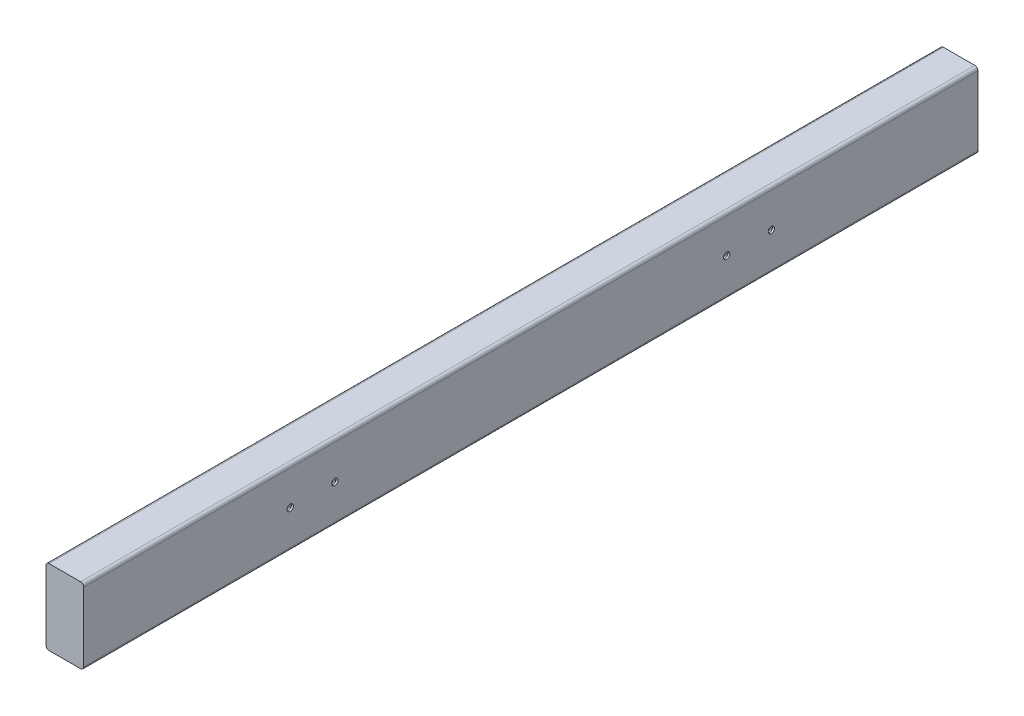
ISO-10303-21;
HEADER;
FILE_DESCRIPTION(('STEP AP214'),'2;1');
FILE_NAME('part.step','',(''),(''),'','','');
FILE_SCHEMA(('AUTOMOTIVE_DESIGN { 1 0 10303 214 1 1 1 1 }'));
ENDSEC;
DATA;
#1=APPLICATION_CONTEXT('core data for automotive mechanical design processes');
#2=APPLICATION_PROTOCOL_DEFINITION('international standard','automotive_design',2000,#1);
#3=PRODUCT_CONTEXT('',#1,'mechanical');
#4=PRODUCT('Part','Part','',(#3));
#5=PRODUCT_RELATED_PRODUCT_CATEGORY('part','',(#4));
#6=PRODUCT_DEFINITION_FORMATION('','',#4);
#7=PRODUCT_DEFINITION_CONTEXT('part definition',#1,'design');
#8=PRODUCT_DEFINITION('design','',#6,#7);
#9=PRODUCT_DEFINITION_SHAPE('','',#8);
#10=(LENGTH_UNIT() NAMED_UNIT(*) SI_UNIT(.MILLI.,.METRE.));
#11=(NAMED_UNIT(*) PLANE_ANGLE_UNIT() SI_UNIT($,.RADIAN.));
#12=(NAMED_UNIT(*) SI_UNIT($,.STERADIAN.) SOLID_ANGLE_UNIT());
#13=UNCERTAINTY_MEASURE_WITH_UNIT(LENGTH_MEASURE(1.E-05),#10,'distance_accuracy_value','');
#14=(GEOMETRIC_REPRESENTATION_CONTEXT(3) GLOBAL_UNCERTAINTY_ASSIGNED_CONTEXT((#13)) GLOBAL_UNIT_ASSIGNED_CONTEXT((#10,
#11,#12)) REPRESENTATION_CONTEXT('',''));
#15=CARTESIAN_POINT('',(0.,0.,0.));
#16=DIRECTION('',(0.,0.,1.));
#17=DIRECTION('',(1.,0.,0.));
#18=AXIS2_PLACEMENT_3D('',#15,#16,#17);
#19=CARTESIAN_POINT('',(-25.,4.99999999999994,710.));
#20=DIRECTION('',(0.,0.,-1.));
#21=DIRECTION('',(-1.,0.,0.));
#22=AXIS2_PLACEMENT_3D('',#19,#20,#21);
#23=CYLINDRICAL_SURFACE('',#22,5.);
#24=DIRECTION('',(0.,0.,-1.));
#25=VECTOR('',#24,1.);
#26=CARTESIAN_POINT('',(-30.,4.99999999999998,710.));
#27=LINE('',#26,#25);
#28=CARTESIAN_POINT('',(-30.,4.99999999999998,712.));
#29=VERTEX_POINT('',#28);
#30=CARTESIAN_POINT('',(-30.,4.99999999999994,-712.));
#31=VERTEX_POINT('',#30);
#32=EDGE_CURVE('E177',#29,#31,#27,.T.);
#33=ORIENTED_EDGE('',*,*,#32,.T.);
#34=CARTESIAN_POINT('',(-25.,4.99999999999994,-712.));
#35=DIRECTION('',(0.,0.,-1.));
#36=DIRECTION('',(-1.,0.,0.));
#37=AXIS2_PLACEMENT_3D('',#34,#35,#36);
#38=CIRCLE('',#37,5.);
#39=CARTESIAN_POINT('',(-25.,0.,-712.));
#40=VERTEX_POINT('',#39);
#41=EDGE_CURVE('E349',#40,#31,#38,.T.);
#42=ORIENTED_EDGE('',*,*,#41,.F.);
#43=DIRECTION('',(0.,0.,-1.));
#44=VECTOR('',#43,1.);
#45=CARTESIAN_POINT('',(-25.,0.,710.));
#46=LINE('',#45,#44);
#47=CARTESIAN_POINT('',(-25.,0.,712.));
#48=VERTEX_POINT('',#47);
#49=EDGE_CURVE('E12',#48,#40,#46,.T.);
#50=ORIENTED_EDGE('',*,*,#49,.F.);
#51=CARTESIAN_POINT('',(-25.,4.99999999999994,712.));
#52=DIRECTION('',(0.,0.,1.));
#53=DIRECTION('',(1.,0.,0.));
#54=AXIS2_PLACEMENT_3D('',#51,#52,#53);
#55=CIRCLE('',#54,5.);
#56=EDGE_CURVE('E347',#29,#48,#55,.T.);
#57=ORIENTED_EDGE('',*,*,#56,.F.);
#58=EDGE_LOOP('',(#33,#42,#50,#57));
#59=FACE_BOUND('',#58,.T.);
#60=ADVANCED_FACE('F83',(#59),#23,.T.);
#61=CARTESIAN_POINT('',(-25.,0.,710.));
#62=DIRECTION('',(0.,1.,0.));
#63=DIRECTION('',(0.,0.,1.));
#64=AXIS2_PLACEMENT_3D('',#61,#62,#63);
#65=PLANE('',#64);
#66=ORIENTED_EDGE('',*,*,#49,.T.);
#67=DIRECTION('',(-1.,0.,0.));
#68=VECTOR('',#67,1.);
#69=CARTESIAN_POINT('',(25.,0.,-712.));
#70=LINE('',#69,#68);
#71=CARTESIAN_POINT('',(25.,0.,-712.));
#72=VERTEX_POINT('',#71);
#73=EDGE_CURVE('E201',#72,#40,#70,.T.);
#74=ORIENTED_EDGE('',*,*,#73,.F.);
#75=DIRECTION('',(0.,0.,-1.));
#76=VECTOR('',#75,1.);
#77=CARTESIAN_POINT('',(25.,0.,710.));
#78=LINE('',#77,#76);
#79=CARTESIAN_POINT('',(25.,0.,712.));
#80=VERTEX_POINT('',#79);
#81=EDGE_CURVE('E92',#80,#72,#78,.T.);
#82=ORIENTED_EDGE('',*,*,#81,.F.);
#83=DIRECTION('',(1.,0.,0.));
#84=VECTOR('',#83,1.);
#85=CARTESIAN_POINT('',(-25.,0.,712.));
#86=LINE('',#85,#84);
#87=EDGE_CURVE('E351',#48,#80,#86,.T.);
#88=ORIENTED_EDGE('',*,*,#87,.F.);
#89=EDGE_LOOP('',(#66,#74,#82,#88));
#90=FACE_BOUND('',#89,.T.);
#91=ADVANCED_FACE('F352',(#90),#65,.F.);
#92=CARTESIAN_POINT('',(25.,4.99999999999994,710.));
#93=DIRECTION('',(0.,0.,-1.));
#94=DIRECTION('',(-1.,0.,0.));
#95=AXIS2_PLACEMENT_3D('',#92,#93,#94);
#96=CYLINDRICAL_SURFACE('',#95,5.);
#97=ORIENTED_EDGE('',*,*,#81,.T.);
#98=CARTESIAN_POINT('',(25.,4.99999999999994,-712.));
#99=DIRECTION('',(0.,0.,-1.));
#100=DIRECTION('',(-1.,0.,0.));
#101=AXIS2_PLACEMENT_3D('',#98,#99,#100);
#102=CIRCLE('',#101,5.);
#103=CARTESIAN_POINT('',(30.,4.99999999999998,-712.));
#104=VERTEX_POINT('',#103);
#105=EDGE_CURVE('E394',#104,#72,#102,.T.);
#106=ORIENTED_EDGE('',*,*,#105,.F.);
#107=DIRECTION('',(0.,0.,-1.));
#108=VECTOR('',#107,1.);
#109=CARTESIAN_POINT('',(30.,4.99999999999998,710.));
#110=LINE('',#109,#108);
#111=CARTESIAN_POINT('',(30.,4.99999999999994,712.));
#112=VERTEX_POINT('',#111);
#113=EDGE_CURVE('E192',#112,#104,#110,.T.);
#114=ORIENTED_EDGE('',*,*,#113,.F.);
#115=CARTESIAN_POINT('',(25.,4.99999999999994,712.));
#116=DIRECTION('',(0.,0.,1.));
#117=DIRECTION('',(1.,0.,0.));
#118=AXIS2_PLACEMENT_3D('',#115,#116,#117);
#119=CIRCLE('',#118,5.);
#120=EDGE_CURVE('E356',#80,#112,#119,.T.);
#121=ORIENTED_EDGE('',*,*,#120,.F.);
#122=EDGE_LOOP('',(#97,#106,#114,#121));
#123=FACE_BOUND('',#122,.T.);
#124=ADVANCED_FACE('F434',(#123),#96,.T.);
#125=CARTESIAN_POINT('',(30.,115.,710.));
#126=DIRECTION('',(-1.,0.,0.));
#127=DIRECTION('',(0.,-1.,0.));
#128=AXIS2_PLACEMENT_3D('',#125,#126,#127);
#129=PLANE('',#128);
#130=CARTESIAN_POINT('',(30.,60.,383.000000000009));
#131=DIRECTION('',(-1.,0.,0.));
#132=DIRECTION('',(0.,-1.,0.));
#133=AXIS2_PLACEMENT_3D('',#130,#131,#132);
#134=CIRCLE('',#133,5.00000000000005);
#135=CARTESIAN_POINT('',(30.,55.,383.000000000009));
#136=VERTEX_POINT('',#135);
#137=EDGE_CURVE('E235',#136,#136,#134,.F.);
#138=ORIENTED_EDGE('',*,*,#137,.F.);
#139=EDGE_LOOP('',(#138));
#140=FACE_BOUND('',#139,.T.);
#141=CARTESIAN_POINT('',(30.,60.,312.000000000005));
#142=DIRECTION('',(-1.,0.,0.));
#143=DIRECTION('',(0.,-1.,0.));
#144=AXIS2_PLACEMENT_3D('',#141,#142,#143);
#145=CIRCLE('',#144,5.00000000000005);
#146=CARTESIAN_POINT('',(30.,55.,312.000000000005));
#147=VERTEX_POINT('',#146);
#148=EDGE_CURVE('E226',#147,#147,#145,.F.);
#149=ORIENTED_EDGE('',*,*,#148,.F.);
#150=EDGE_LOOP('',(#149));
#151=FACE_BOUND('',#150,.T.);
#152=CARTESIAN_POINT('',(30.,60.,-383.000000000009));
#153=DIRECTION('',(-1.,0.,0.));
#154=DIRECTION('',(0.,-1.,0.));
#155=AXIS2_PLACEMENT_3D('',#152,#153,#154);
#156=CIRCLE('',#155,5.00000000000005);
#157=CARTESIAN_POINT('',(30.,55.,-383.000000000009));
#158=VERTEX_POINT('',#157);
#159=EDGE_CURVE('E209',#158,#158,#156,.F.);
#160=ORIENTED_EDGE('',*,*,#159,.F.);
#161=EDGE_LOOP('',(#160));
#162=FACE_BOUND('',#161,.T.);
#163=CARTESIAN_POINT('',(30.,60.,-312.000000000005));
#164=DIRECTION('',(-1.,0.,0.));
#165=DIRECTION('',(0.,-1.,0.));
#166=AXIS2_PLACEMENT_3D('',#163,#164,#165);
#167=CIRCLE('',#166,5.00000000000005);
#168=CARTESIAN_POINT('',(30.,55.,-312.000000000005));
#169=VERTEX_POINT('',#168);
#170=EDGE_CURVE('E205',#169,#169,#167,.F.);
#171=ORIENTED_EDGE('',*,*,#170,.F.);
#172=EDGE_LOOP('',(#171));
#173=FACE_BOUND('',#172,.T.);
#174=ORIENTED_EDGE('',*,*,#113,.T.);
#175=DIRECTION('',(0.,-1.,0.));
#176=VECTOR('',#175,1.);
#177=CARTESIAN_POINT('',(30.,115.,-712.));
#178=LINE('',#177,#176);
#179=CARTESIAN_POINT('',(30.,115.,-712.));
#180=VERTEX_POINT('',#179);
#181=EDGE_CURVE('E391',#180,#104,#178,.T.);
#182=ORIENTED_EDGE('',*,*,#181,.F.);
#183=DIRECTION('',(0.,0.,-1.));
#184=VECTOR('',#183,1.);
#185=CARTESIAN_POINT('',(30.,115.,710.));
#186=LINE('',#185,#184);
#187=CARTESIAN_POINT('',(30.,115.,712.));
#188=VERTEX_POINT('',#187);
#189=EDGE_CURVE('E189',#188,#180,#186,.T.);
#190=ORIENTED_EDGE('',*,*,#189,.F.);
#191=DIRECTION('',(0.,1.,0.));
#192=VECTOR('',#191,1.);
#193=CARTESIAN_POINT('',(30.,4.99999999999994,712.));
#194=LINE('',#193,#192);
#195=EDGE_CURVE('E366',#112,#188,#194,.T.);
#196=ORIENTED_EDGE('',*,*,#195,.F.);
#197=EDGE_LOOP('',(#174,#182,#190,#196));
#198=FACE_BOUND('',#197,.T.);
#199=ADVANCED_FACE('F438',(#140,#151,#162,#173,#198),#129,.F.);
#200=CARTESIAN_POINT('',(25.,115.,710.));
#201=DIRECTION('',(0.,0.,-1.));
#202=DIRECTION('',(-1.,0.,0.));
#203=AXIS2_PLACEMENT_3D('',#200,#201,#202);
#204=CYLINDRICAL_SURFACE('',#203,5.);
#205=ORIENTED_EDGE('',*,*,#189,.T.);
#206=CARTESIAN_POINT('',(25.,115.,-712.));
#207=DIRECTION('',(0.,0.,-1.));
#208=DIRECTION('',(-1.,0.,0.));
#209=AXIS2_PLACEMENT_3D('',#206,#207,#208);
#210=CIRCLE('',#209,5.);
#211=CARTESIAN_POINT('',(25.,120.,-712.));
#212=VERTEX_POINT('',#211);
#213=EDGE_CURVE('E388',#212,#180,#210,.T.);
#214=ORIENTED_EDGE('',*,*,#213,.F.);
#215=DIRECTION('',(0.,0.,-1.));
#216=VECTOR('',#215,1.);
#217=CARTESIAN_POINT('',(25.,120.,710.));
#218=LINE('',#217,#216);
#219=CARTESIAN_POINT('',(25.,120.,712.));
#220=VERTEX_POINT('',#219);
#221=EDGE_CURVE('E186',#220,#212,#218,.T.);
#222=ORIENTED_EDGE('',*,*,#221,.F.);
#223=CARTESIAN_POINT('',(25.,115.,712.));
#224=DIRECTION('',(0.,0.,1.));
#225=DIRECTION('',(1.,0.,0.));
#226=AXIS2_PLACEMENT_3D('',#223,#224,#225);
#227=CIRCLE('',#226,5.);
#228=EDGE_CURVE('E369',#188,#220,#227,.T.);
#229=ORIENTED_EDGE('',*,*,#228,.F.);
#230=EDGE_LOOP('',(#205,#214,#222,#229));
#231=FACE_BOUND('',#230,.T.);
#232=ADVANCED_FACE('F444',(#231),#204,.T.);
#233=CARTESIAN_POINT('',(-25.,120.,710.));
#234=DIRECTION('',(0.,-1.,0.));
#235=DIRECTION('',(0.,0.,-1.));
#236=AXIS2_PLACEMENT_3D('',#233,#234,#235);
#237=PLANE('',#236);
#238=ORIENTED_EDGE('',*,*,#221,.T.);
#239=DIRECTION('',(1.,0.,0.));
#240=VECTOR('',#239,1.);
#241=CARTESIAN_POINT('',(-25.,120.,-712.));
#242=LINE('',#241,#240);
#243=CARTESIAN_POINT('',(-25.,120.,-712.));
#244=VERTEX_POINT('',#243);
#245=EDGE_CURVE('E385',#244,#212,#242,.T.);
#246=ORIENTED_EDGE('',*,*,#245,.F.);
#247=DIRECTION('',(0.,0.,-1.));
#248=VECTOR('',#247,1.);
#249=CARTESIAN_POINT('',(-25.,120.,710.));
#250=LINE('',#249,#248);
#251=CARTESIAN_POINT('',(-25.,120.,712.));
#252=VERTEX_POINT('',#251);
#253=EDGE_CURVE('E183',#252,#244,#250,.T.);
#254=ORIENTED_EDGE('',*,*,#253,.F.);
#255=DIRECTION('',(-1.,0.,0.));
#256=VECTOR('',#255,1.);
#257=CARTESIAN_POINT('',(25.,120.,712.));
#258=LINE('',#257,#256);
#259=EDGE_CURVE('E372',#220,#252,#258,.T.);
#260=ORIENTED_EDGE('',*,*,#259,.F.);
#261=EDGE_LOOP('',(#238,#246,#254,#260));
#262=FACE_BOUND('',#261,.T.);
#263=ADVANCED_FACE('F448',(#262),#237,.F.);
#264=CARTESIAN_POINT('',(-25.,115.,710.));
#265=DIRECTION('',(0.,0.,-1.));
#266=DIRECTION('',(-1.,0.,0.));
#267=AXIS2_PLACEMENT_3D('',#264,#265,#266);
#268=CYLINDRICAL_SURFACE('',#267,5.);
#269=ORIENTED_EDGE('',*,*,#253,.T.);
#270=CARTESIAN_POINT('',(-25.,115.,-712.));
#271=DIRECTION('',(0.,0.,-1.));
#272=DIRECTION('',(-1.,0.,0.));
#273=AXIS2_PLACEMENT_3D('',#270,#271,#272);
#274=CIRCLE('',#273,5.);
#275=CARTESIAN_POINT('',(-30.,115.,-712.));
#276=VERTEX_POINT('',#275);
#277=EDGE_CURVE('E382',#276,#244,#274,.T.);
#278=ORIENTED_EDGE('',*,*,#277,.F.);
#279=DIRECTION('',(0.,0.,-1.));
#280=VECTOR('',#279,1.);
#281=CARTESIAN_POINT('',(-30.,115.,710.));
#282=LINE('',#281,#280);
#283=CARTESIAN_POINT('',(-30.,115.,712.));
#284=VERTEX_POINT('',#283);
#285=EDGE_CURVE('E180',#284,#276,#282,.T.);
#286=ORIENTED_EDGE('',*,*,#285,.F.);
#287=CARTESIAN_POINT('',(-25.,115.,712.));
#288=DIRECTION('',(0.,0.,1.));
#289=DIRECTION('',(1.,0.,0.));
#290=AXIS2_PLACEMENT_3D('',#287,#288,#289);
#291=CIRCLE('',#290,5.);
#292=EDGE_CURVE('E375',#252,#284,#291,.T.);
#293=ORIENTED_EDGE('',*,*,#292,.F.);
#294=EDGE_LOOP('',(#269,#278,#286,#293));
#295=FACE_BOUND('',#294,.T.);
#296=ADVANCED_FACE('F452',(#295),#268,.T.);
#297=CARTESIAN_POINT('',(-30.,115.,710.));
#298=DIRECTION('',(1.,0.,0.));
#299=DIRECTION('',(0.,0.,-1.));
#300=AXIS2_PLACEMENT_3D('',#297,#298,#299);
#301=PLANE('',#300);
#302=CARTESIAN_POINT('',(-30.,60.,383.000000000009));
#303=DIRECTION('',(1.,0.,0.));
#304=DIRECTION('',(0.,0.,-1.));
#305=AXIS2_PLACEMENT_3D('',#302,#303,#304);
#306=CIRCLE('',#305,5.00000000000005);
#307=CARTESIAN_POINT('',(-30.,60.,378.000000000009));
#308=VERTEX_POINT('',#307);
#309=EDGE_CURVE('E232',#308,#308,#306,.F.);
#310=ORIENTED_EDGE('',*,*,#309,.F.);
#311=EDGE_LOOP('',(#310));
#312=FACE_BOUND('',#311,.T.);
#313=CARTESIAN_POINT('',(-30.,60.,312.000000000005));
#314=DIRECTION('',(1.,0.,0.));
#315=DIRECTION('',(0.,0.,-1.));
#316=AXIS2_PLACEMENT_3D('',#313,#314,#315);
#317=CIRCLE('',#316,5.00000000000005);
#318=CARTESIAN_POINT('',(-30.,60.,307.000000000005));
#319=VERTEX_POINT('',#318);
#320=EDGE_CURVE('E213',#319,#319,#317,.F.);
#321=ORIENTED_EDGE('',*,*,#320,.F.);
#322=EDGE_LOOP('',(#321));
#323=FACE_BOUND('',#322,.T.);
#324=CARTESIAN_POINT('',(-30.,60.,-383.000000000009));
#325=DIRECTION('',(1.,0.,0.));
#326=DIRECTION('',(0.,0.,-1.));
#327=AXIS2_PLACEMENT_3D('',#324,#325,#326);
#328=CIRCLE('',#327,5.00000000000005);
#329=CARTESIAN_POINT('',(-30.,60.,-388.000000000009));
#330=VERTEX_POINT('',#329);
#331=EDGE_CURVE('E216',#330,#330,#328,.F.);
#332=ORIENTED_EDGE('',*,*,#331,.F.);
#333=EDGE_LOOP('',(#332));
#334=FACE_BOUND('',#333,.T.);
#335=CARTESIAN_POINT('',(-30.,60.,-312.000000000005));
#336=DIRECTION('',(1.,0.,0.));
#337=DIRECTION('',(0.,0.,-1.));
#338=AXIS2_PLACEMENT_3D('',#335,#336,#337);
#339=CIRCLE('',#338,5.00000000000005);
#340=CARTESIAN_POINT('',(-30.,60.,-317.000000000005));
#341=VERTEX_POINT('',#340);
#342=EDGE_CURVE('E400',#341,#341,#339,.F.);
#343=ORIENTED_EDGE('',*,*,#342,.F.);
#344=EDGE_LOOP('',(#343));
#345=FACE_BOUND('',#344,.T.);
#346=ORIENTED_EDGE('',*,*,#285,.T.);
#347=DIRECTION('',(0.,1.,0.));
#348=VECTOR('',#347,1.);
#349=CARTESIAN_POINT('',(-30.,4.99999999999994,-712.));
#350=LINE('',#349,#348);
#351=EDGE_CURVE('E379',#31,#276,#350,.T.);
#352=ORIENTED_EDGE('',*,*,#351,.F.);
#353=ORIENTED_EDGE('',*,*,#32,.F.);
#354=DIRECTION('',(0.,-1.,0.));
#355=VECTOR('',#354,1.);
#356=CARTESIAN_POINT('',(-30.,115.,712.));
#357=LINE('',#356,#355);
#358=EDGE_CURVE('E362',#284,#29,#357,.T.);
#359=ORIENTED_EDGE('',*,*,#358,.F.);
#360=EDGE_LOOP('',(#346,#352,#353,#359));
#361=FACE_BOUND('',#360,.T.);
#362=ADVANCED_FACE('F456',(#312,#323,#334,#345,#361),#301,.F.);
#363=CARTESIAN_POINT('',(-25.,4.99999999999994,710.));
#364=DIRECTION('',(0.,0.,-1.));
#365=DIRECTION('',(-1.,0.,0.));
#366=AXIS2_PLACEMENT_3D('',#363,#364,#365);
#367=CYLINDRICAL_SURFACE('',#366,2.);
#368=CARTESIAN_POINT('',(-25.,4.99999999999994,-710.));
#369=DIRECTION('',(0.,0.,1.));
#370=DIRECTION('',(1.,0.,0.));
#371=AXIS2_PLACEMENT_3D('',#368,#369,#370);
#372=CIRCLE('',#371,2.);
#373=CARTESIAN_POINT('',(-27.,4.99999999999998,-710.));
#374=VERTEX_POINT('',#373);
#375=CARTESIAN_POINT('',(-25.,2.99999999999994,-710.));
#376=VERTEX_POINT('',#375);
#377=EDGE_CURVE('E238',#374,#376,#372,.T.);
#378=ORIENTED_EDGE('',*,*,#377,.F.);
#379=DIRECTION('',(0.,0.,-1.));
#380=VECTOR('',#379,1.);
#381=CARTESIAN_POINT('',(-27.,4.99999999999998,710.));
#382=LINE('',#381,#380);
#383=CARTESIAN_POINT('',(-27.,4.99999999999998,710.));
#384=VERTEX_POINT('',#383);
#385=EDGE_CURVE('E162',#384,#374,#382,.T.);
#386=ORIENTED_EDGE('',*,*,#385,.F.);
#387=CARTESIAN_POINT('',(-25.,4.99999999999994,710.));
#388=DIRECTION('',(0.,0.,1.));
#389=DIRECTION('',(1.,0.,0.));
#390=AXIS2_PLACEMENT_3D('',#387,#388,#389);
#391=CIRCLE('',#390,2.);
#392=CARTESIAN_POINT('',(-25.,2.99999999999994,710.));
#393=VERTEX_POINT('',#392);
#394=EDGE_CURVE('E161',#384,#393,#391,.T.);
#395=ORIENTED_EDGE('',*,*,#394,.T.);
#396=DIRECTION('',(0.,0.,-1.));
#397=VECTOR('',#396,1.);
#398=CARTESIAN_POINT('',(-25.,2.99999999999994,710.));
#399=LINE('',#398,#397);
#400=EDGE_CURVE('E174',#393,#376,#399,.T.);
#401=ORIENTED_EDGE('',*,*,#400,.T.);
#402=EDGE_LOOP('',(#378,#386,#395,#401));
#403=FACE_BOUND('',#402,.T.);
#404=ADVANCED_FACE('F312',(#403),#367,.F.);
#405=CARTESIAN_POINT('',(-25.,2.99999999999994,710.));
#406=DIRECTION('',(0.,1.,0.));
#407=DIRECTION('',(0.,0.,1.));
#408=AXIS2_PLACEMENT_3D('',#405,#406,#407);
#409=PLANE('',#408);
#410=DIRECTION('',(1.,0.,0.));
#411=VECTOR('',#410,1.);
#412=CARTESIAN_POINT('',(-25.,2.99999999999994,-710.));
#413=LINE('',#412,#411);
#414=CARTESIAN_POINT('',(25.,2.99999999999994,-710.));
#415=VERTEX_POINT('',#414);
#416=EDGE_CURVE('E257',#376,#415,#413,.T.);
#417=ORIENTED_EDGE('',*,*,#416,.F.);
#418=ORIENTED_EDGE('',*,*,#400,.F.);
#419=DIRECTION('',(1.,0.,0.));
#420=VECTOR('',#419,1.);
#421=CARTESIAN_POINT('',(-25.,2.99999999999994,710.));
#422=LINE('',#421,#420);
#423=CARTESIAN_POINT('',(25.,2.99999999999994,710.));
#424=VERTEX_POINT('',#423);
#425=EDGE_CURVE('E241',#393,#424,#422,.T.);
#426=ORIENTED_EDGE('',*,*,#425,.T.);
#427=DIRECTION('',(0.,0.,-1.));
#428=VECTOR('',#427,1.);
#429=CARTESIAN_POINT('',(25.,2.99999999999994,710.));
#430=LINE('',#429,#428);
#431=EDGE_CURVE('E172',#424,#415,#430,.T.);
#432=ORIENTED_EDGE('',*,*,#431,.T.);
#433=EDGE_LOOP('',(#417,#418,#426,#432));
#434=FACE_BOUND('',#433,.T.);
#435=ADVANCED_FACE('F315',(#434),#409,.T.);
#436=CARTESIAN_POINT('',(25.,4.99999999999994,710.));
#437=DIRECTION('',(0.,0.,-1.));
#438=DIRECTION('',(-1.,0.,0.));
#439=AXIS2_PLACEMENT_3D('',#436,#437,#438);
#440=CYLINDRICAL_SURFACE('',#439,2.);
#441=CARTESIAN_POINT('',(25.,4.99999999999994,-710.));
#442=DIRECTION('',(0.,0.,1.));
#443=DIRECTION('',(1.,0.,0.));
#444=AXIS2_PLACEMENT_3D('',#441,#442,#443);
#445=CIRCLE('',#444,2.);
#446=CARTESIAN_POINT('',(27.,4.99999999999996,-710.));
#447=VERTEX_POINT('',#446);
#448=EDGE_CURVE('E260',#415,#447,#445,.T.);
#449=ORIENTED_EDGE('',*,*,#448,.F.);
#450=ORIENTED_EDGE('',*,*,#431,.F.);
#451=CARTESIAN_POINT('',(25.,4.99999999999994,710.));
#452=DIRECTION('',(0.,0.,1.));
#453=DIRECTION('',(1.,0.,0.));
#454=AXIS2_PLACEMENT_3D('',#451,#452,#453);
#455=CIRCLE('',#454,2.);
#456=CARTESIAN_POINT('',(27.,4.99999999999996,710.));
#457=VERTEX_POINT('',#456);
#458=EDGE_CURVE('E244',#424,#457,#455,.T.);
#459=ORIENTED_EDGE('',*,*,#458,.T.);
#460=DIRECTION('',(0.,0.,-1.));
#461=VECTOR('',#460,1.);
#462=CARTESIAN_POINT('',(27.,4.99999999999996,710.));
#463=LINE('',#462,#461);
#464=EDGE_CURVE('E170',#457,#447,#463,.T.);
#465=ORIENTED_EDGE('',*,*,#464,.T.);
#466=EDGE_LOOP('',(#449,#450,#459,#465));
#467=FACE_BOUND('',#466,.T.);
#468=ADVANCED_FACE('F318',(#467),#440,.F.);
#469=CARTESIAN_POINT('',(27.,115.,710.));
#470=DIRECTION('',(-1.,0.,0.));
#471=DIRECTION('',(0.,-1.,0.));
#472=AXIS2_PLACEMENT_3D('',#469,#470,#471);
#473=PLANE('',#472);
#474=CARTESIAN_POINT('',(27.,60.,383.000000000009));
#475=DIRECTION('',(-1.,0.,0.));
#476=DIRECTION('',(0.,-1.,0.));
#477=AXIS2_PLACEMENT_3D('',#474,#475,#476);
#478=CIRCLE('',#477,5.00000000000005);
#479=CARTESIAN_POINT('',(27.,55.,383.000000000009));
#480=VERTEX_POINT('',#479);
#481=EDGE_CURVE('E229',#480,#480,#478,.F.);
#482=ORIENTED_EDGE('',*,*,#481,.T.);
#483=EDGE_LOOP('',(#482));
#484=FACE_BOUND('',#483,.T.);
#485=CARTESIAN_POINT('',(27.,60.,312.000000000005));
#486=DIRECTION('',(-1.,0.,0.));
#487=DIRECTION('',(0.,-1.,0.));
#488=AXIS2_PLACEMENT_3D('',#485,#486,#487);
#489=CIRCLE('',#488,5.00000000000005);
#490=CARTESIAN_POINT('',(27.,55.,312.000000000005));
#491=VERTEX_POINT('',#490);
#492=EDGE_CURVE('E208',#491,#491,#489,.F.);
#493=ORIENTED_EDGE('',*,*,#492,.T.);
#494=EDGE_LOOP('',(#493));
#495=FACE_BOUND('',#494,.T.);
#496=CARTESIAN_POINT('',(27.,60.,-383.000000000009));
#497=DIRECTION('',(-1.,0.,0.));
#498=DIRECTION('',(0.,-1.,0.));
#499=AXIS2_PLACEMENT_3D('',#496,#497,#498);
#500=CIRCLE('',#499,5.00000000000005);
#501=CARTESIAN_POINT('',(27.,55.,-383.000000000009));
#502=VERTEX_POINT('',#501);
#503=EDGE_CURVE('E204',#502,#502,#500,.F.);
#504=ORIENTED_EDGE('',*,*,#503,.T.);
#505=EDGE_LOOP('',(#504));
#506=FACE_BOUND('',#505,.T.);
#507=CARTESIAN_POINT('',(27.,60.,-312.000000000005));
#508=DIRECTION('',(-1.,0.,0.));
#509=DIRECTION('',(0.,-1.,0.));
#510=AXIS2_PLACEMENT_3D('',#507,#508,#509);
#511=CIRCLE('',#510,5.00000000000005);
#512=CARTESIAN_POINT('',(27.,55.,-312.000000000005));
#513=VERTEX_POINT('',#512);
#514=EDGE_CURVE('E200',#513,#513,#511,.F.);
#515=ORIENTED_EDGE('',*,*,#514,.T.);
#516=EDGE_LOOP('',(#515));
#517=FACE_BOUND('',#516,.T.);
#518=DIRECTION('',(0.,1.,0.));
#519=VECTOR('',#518,1.);
#520=CARTESIAN_POINT('',(27.,115.,-710.));
#521=LINE('',#520,#519);
#522=CARTESIAN_POINT('',(27.,115.,-710.));
#523=VERTEX_POINT('',#522);
#524=EDGE_CURVE('E156',#447,#523,#521,.T.);
#525=ORIENTED_EDGE('',*,*,#524,.F.);
#526=ORIENTED_EDGE('',*,*,#464,.F.);
#527=DIRECTION('',(0.,1.,0.));
#528=VECTOR('',#527,1.);
#529=CARTESIAN_POINT('',(27.,115.,710.));
#530=LINE('',#529,#528);
#531=CARTESIAN_POINT('',(27.,115.,710.));
#532=VERTEX_POINT('',#531);
#533=EDGE_CURVE('E100',#457,#532,#530,.T.);
#534=ORIENTED_EDGE('',*,*,#533,.T.);
#535=DIRECTION('',(0.,0.,-1.));
#536=VECTOR('',#535,1.);
#537=CARTESIAN_POINT('',(27.,115.,710.));
#538=LINE('',#537,#536);
#539=EDGE_CURVE('E168',#532,#523,#538,.T.);
#540=ORIENTED_EDGE('',*,*,#539,.T.);
#541=EDGE_LOOP('',(#525,#526,#534,#540));
#542=FACE_BOUND('',#541,.T.);
#543=ADVANCED_FACE('F266',(#484,#495,#506,#517,#542),#473,.T.);
#544=CARTESIAN_POINT('',(25.,115.,710.));
#545=DIRECTION('',(0.,0.,-1.));
#546=DIRECTION('',(-1.,0.,0.));
#547=AXIS2_PLACEMENT_3D('',#544,#545,#546);
#548=CYLINDRICAL_SURFACE('',#547,2.);
#549=CARTESIAN_POINT('',(25.,115.,-710.));
#550=DIRECTION('',(0.,0.,1.));
#551=DIRECTION('',(1.,0.,0.));
#552=AXIS2_PLACEMENT_3D('',#549,#550,#551);
#553=CIRCLE('',#552,2.);
#554=CARTESIAN_POINT('',(25.,117.,-710.));
#555=VERTEX_POINT('',#554);
#556=EDGE_CURVE('E154',#523,#555,#553,.T.);
#557=ORIENTED_EDGE('',*,*,#556,.F.);
#558=ORIENTED_EDGE('',*,*,#539,.F.);
#559=CARTESIAN_POINT('',(25.,115.,710.));
#560=DIRECTION('',(0.,0.,1.));
#561=DIRECTION('',(1.,0.,0.));
#562=AXIS2_PLACEMENT_3D('',#559,#560,#561);
#563=CIRCLE('',#562,2.);
#564=CARTESIAN_POINT('',(25.,117.,710.));
#565=VERTEX_POINT('',#564);
#566=EDGE_CURVE('E247',#532,#565,#563,.T.);
#567=ORIENTED_EDGE('',*,*,#566,.T.);
#568=DIRECTION('',(0.,0.,-1.));
#569=VECTOR('',#568,1.);
#570=CARTESIAN_POINT('',(25.,117.,710.));
#571=LINE('',#570,#569);
#572=EDGE_CURVE('E139',#565,#555,#571,.T.);
#573=ORIENTED_EDGE('',*,*,#572,.T.);
#574=EDGE_LOOP('',(#557,#558,#567,#573));
#575=FACE_BOUND('',#574,.T.);
#576=ADVANCED_FACE('F270',(#575),#548,.F.);
#577=CARTESIAN_POINT('',(-25.,117.,710.));
#578=DIRECTION('',(0.,-1.,0.));
#579=DIRECTION('',(0.,0.,-1.));
#580=AXIS2_PLACEMENT_3D('',#577,#578,#579);
#581=PLANE('',#580);
#582=DIRECTION('',(-1.,0.,0.));
#583=VECTOR('',#582,1.);
#584=CARTESIAN_POINT('',(-25.,117.,-710.));
#585=LINE('',#584,#583);
#586=CARTESIAN_POINT('',(-25.,117.,-710.));
#587=VERTEX_POINT('',#586);
#588=EDGE_CURVE('E132',#555,#587,#585,.T.);
#589=ORIENTED_EDGE('',*,*,#588,.F.);
#590=ORIENTED_EDGE('',*,*,#572,.F.);
#591=DIRECTION('',(-1.,0.,0.));
#592=VECTOR('',#591,1.);
#593=CARTESIAN_POINT('',(-25.,117.,710.));
#594=LINE('',#593,#592);
#595=CARTESIAN_POINT('',(-25.,117.,710.));
#596=VERTEX_POINT('',#595);
#597=EDGE_CURVE('E136',#565,#596,#594,.T.);
#598=ORIENTED_EDGE('',*,*,#597,.T.);
#599=DIRECTION('',(0.,0.,-1.));
#600=VECTOR('',#599,1.);
#601=CARTESIAN_POINT('',(-25.,117.,710.));
#602=LINE('',#601,#600);
#603=EDGE_CURVE('E127',#596,#587,#602,.T.);
#604=ORIENTED_EDGE('',*,*,#603,.T.);
#605=EDGE_LOOP('',(#589,#590,#598,#604));
#606=FACE_BOUND('',#605,.T.);
#607=ADVANCED_FACE('F129',(#606),#581,.T.);
#608=CARTESIAN_POINT('',(-25.,115.,710.));
#609=DIRECTION('',(0.,0.,-1.));
#610=DIRECTION('',(-1.,0.,0.));
#611=AXIS2_PLACEMENT_3D('',#608,#609,#610);
#612=CYLINDRICAL_SURFACE('',#611,2.);
#613=CARTESIAN_POINT('',(-25.,115.,-710.));
#614=DIRECTION('',(0.,0.,1.));
#615=DIRECTION('',(1.,0.,0.));
#616=AXIS2_PLACEMENT_3D('',#613,#614,#615);
#617=CIRCLE('',#616,2.);
#618=CARTESIAN_POINT('',(-27.,115.,-710.));
#619=VERTEX_POINT('',#618);
#620=EDGE_CURVE('E143',#587,#619,#617,.T.);
#621=ORIENTED_EDGE('',*,*,#620,.F.);
#622=ORIENTED_EDGE('',*,*,#603,.F.);
#623=CARTESIAN_POINT('',(-25.,115.,710.));
#624=DIRECTION('',(0.,0.,1.));
#625=DIRECTION('',(1.,0.,0.));
#626=AXIS2_PLACEMENT_3D('',#623,#624,#625);
#627=CIRCLE('',#626,2.);
#628=CARTESIAN_POINT('',(-27.,115.,710.));
#629=VERTEX_POINT('',#628);
#630=EDGE_CURVE('E251',#596,#629,#627,.T.);
#631=ORIENTED_EDGE('',*,*,#630,.T.);
#632=DIRECTION('',(0.,0.,-1.));
#633=VECTOR('',#632,1.);
#634=CARTESIAN_POINT('',(-27.,115.,710.));
#635=LINE('',#634,#633);
#636=EDGE_CURVE('E140',#629,#619,#635,.T.);
#637=ORIENTED_EDGE('',*,*,#636,.T.);
#638=EDGE_LOOP('',(#621,#622,#631,#637));
#639=FACE_BOUND('',#638,.T.);
#640=ADVANCED_FACE('F144',(#639),#612,.F.);
#641=CARTESIAN_POINT('',(-27.,115.,710.));
#642=DIRECTION('',(1.,0.,0.));
#643=DIRECTION('',(0.,0.,-1.));
#644=AXIS2_PLACEMENT_3D('',#641,#642,#643);
#645=PLANE('',#644);
#646=CARTESIAN_POINT('',(-27.,60.,383.000000000009));
#647=DIRECTION('',(1.,0.,0.));
#648=DIRECTION('',(0.,0.,-1.));
#649=AXIS2_PLACEMENT_3D('',#646,#647,#648);
#650=CIRCLE('',#649,5.00000000000005);
#651=CARTESIAN_POINT('',(-27.,60.,378.000000000009));
#652=VERTEX_POINT('',#651);
#653=EDGE_CURVE('E86',#652,#652,#650,.F.);
#654=ORIENTED_EDGE('',*,*,#653,.T.);
#655=EDGE_LOOP('',(#654));
#656=FACE_BOUND('',#655,.T.);
#657=CARTESIAN_POINT('',(-27.,60.,312.000000000005));
#658=DIRECTION('',(1.,0.,0.));
#659=DIRECTION('',(0.,0.,-1.));
#660=AXIS2_PLACEMENT_3D('',#657,#658,#659);
#661=CIRCLE('',#660,5.00000000000005);
#662=CARTESIAN_POINT('',(-27.,60.,307.000000000005));
#663=VERTEX_POINT('',#662);
#664=EDGE_CURVE('E206',#663,#663,#661,.F.);
#665=ORIENTED_EDGE('',*,*,#664,.T.);
#666=EDGE_LOOP('',(#665));
#667=FACE_BOUND('',#666,.T.);
#668=CARTESIAN_POINT('',(-27.,60.,-383.000000000009));
#669=DIRECTION('',(1.,0.,0.));
#670=DIRECTION('',(0.,0.,-1.));
#671=AXIS2_PLACEMENT_3D('',#668,#669,#670);
#672=CIRCLE('',#671,5.00000000000005);
#673=CARTESIAN_POINT('',(-27.,60.,-388.000000000009));
#674=VERTEX_POINT('',#673);
#675=EDGE_CURVE('E202',#674,#674,#672,.F.);
#676=ORIENTED_EDGE('',*,*,#675,.T.);
#677=EDGE_LOOP('',(#676));
#678=FACE_BOUND('',#677,.T.);
#679=CARTESIAN_POINT('',(-27.,60.,-312.000000000005));
#680=DIRECTION('',(1.,0.,0.));
#681=DIRECTION('',(0.,0.,-1.));
#682=AXIS2_PLACEMENT_3D('',#679,#680,#681);
#683=CIRCLE('',#682,5.00000000000005);
#684=CARTESIAN_POINT('',(-27.,60.,-317.000000000005));
#685=VERTEX_POINT('',#684);
#686=EDGE_CURVE('E197',#685,#685,#683,.F.);
#687=ORIENTED_EDGE('',*,*,#686,.T.);
#688=EDGE_LOOP('',(#687));
#689=FACE_BOUND('',#688,.T.);
#690=DIRECTION('',(0.,-1.,0.));
#691=VECTOR('',#690,1.);
#692=CARTESIAN_POINT('',(-27.,115.,-710.));
#693=LINE('',#692,#691);
#694=EDGE_CURVE('E149',#619,#374,#693,.T.);
#695=ORIENTED_EDGE('',*,*,#694,.F.);
#696=ORIENTED_EDGE('',*,*,#636,.F.);
#697=DIRECTION('',(0.,-1.,0.));
#698=VECTOR('',#697,1.);
#699=CARTESIAN_POINT('',(-27.,115.,710.));
#700=LINE('',#699,#698);
#701=EDGE_CURVE('E165',#629,#384,#700,.T.);
#702=ORIENTED_EDGE('',*,*,#701,.T.);
#703=ORIENTED_EDGE('',*,*,#385,.T.);
#704=EDGE_LOOP('',(#695,#696,#702,#703));
#705=FACE_BOUND('',#704,.T.);
#706=ADVANCED_FACE('F310',(#656,#667,#678,#689,#705),#645,.T.);
#707=CARTESIAN_POINT('',(40.,60.,-312.000000000005));
#708=DIRECTION('',(-1.,0.,0.));
#709=DIRECTION('',(0.,0.,1.));
#710=AXIS2_PLACEMENT_3D('',#707,#708,#709);
#711=CYLINDRICAL_SURFACE('',#710,5.00000000000005);
#712=ORIENTED_EDGE('',*,*,#686,.F.);
#713=EDGE_LOOP('',(#712));
#714=FACE_BOUND('',#713,.T.);
#715=ORIENTED_EDGE('',*,*,#342,.T.);
#716=EDGE_LOOP('',(#715));
#717=FACE_BOUND('',#716,.T.);
#718=ADVANCED_FACE('F426',(#714,#717),#711,.F.);
#719=CARTESIAN_POINT('',(40.,60.,-383.000000000009));
#720=DIRECTION('',(-1.,0.,0.));
#721=DIRECTION('',(0.,0.,1.));
#722=AXIS2_PLACEMENT_3D('',#719,#720,#721);
#723=CYLINDRICAL_SURFACE('',#722,5.00000000000005);
#724=ORIENTED_EDGE('',*,*,#675,.F.);
#725=EDGE_LOOP('',(#724));
#726=FACE_BOUND('',#725,.T.);
#727=ORIENTED_EDGE('',*,*,#331,.T.);
#728=EDGE_LOOP('',(#727));
#729=FACE_BOUND('',#728,.T.);
#730=ADVANCED_FACE('F414',(#726,#729),#723,.F.);
#731=CARTESIAN_POINT('',(40.,60.,312.000000000005));
#732=DIRECTION('',(-1.,0.,0.));
#733=DIRECTION('',(0.,0.,1.));
#734=AXIS2_PLACEMENT_3D('',#731,#732,#733);
#735=CYLINDRICAL_SURFACE('',#734,5.00000000000005);
#736=ORIENTED_EDGE('',*,*,#664,.F.);
#737=EDGE_LOOP('',(#736));
#738=FACE_BOUND('',#737,.T.);
#739=ORIENTED_EDGE('',*,*,#320,.T.);
#740=EDGE_LOOP('',(#739));
#741=FACE_BOUND('',#740,.T.);
#742=ADVANCED_FACE('F422',(#738,#741),#735,.F.);
#743=CARTESIAN_POINT('',(40.,60.,383.000000000009));
#744=DIRECTION('',(-1.,0.,0.));
#745=DIRECTION('',(0.,0.,1.));
#746=AXIS2_PLACEMENT_3D('',#743,#744,#745);
#747=CYLINDRICAL_SURFACE('',#746,5.00000000000005);
#748=ORIENTED_EDGE('',*,*,#653,.F.);
#749=EDGE_LOOP('',(#748));
#750=FACE_BOUND('',#749,.T.);
#751=ORIENTED_EDGE('',*,*,#309,.T.);
#752=EDGE_LOOP('',(#751));
#753=FACE_BOUND('',#752,.T.);
#754=ADVANCED_FACE('F423',(#750,#753),#747,.F.);
#755=ORIENTED_EDGE('',*,*,#514,.F.);
#756=EDGE_LOOP('',(#755));
#757=FACE_BOUND('',#756,.T.);
#758=ORIENTED_EDGE('',*,*,#170,.T.);
#759=EDGE_LOOP('',(#758));
#760=FACE_BOUND('',#759,.T.);
#761=ADVANCED_FACE('F412',(#757,#760),#711,.F.);
#762=ORIENTED_EDGE('',*,*,#503,.F.);
#763=EDGE_LOOP('',(#762));
#764=FACE_BOUND('',#763,.T.);
#765=ORIENTED_EDGE('',*,*,#159,.T.);
#766=EDGE_LOOP('',(#765));
#767=FACE_BOUND('',#766,.T.);
#768=ADVANCED_FACE('F409',(#764,#767),#723,.F.);
#769=ORIENTED_EDGE('',*,*,#492,.F.);
#770=EDGE_LOOP('',(#769));
#771=FACE_BOUND('',#770,.T.);
#772=ORIENTED_EDGE('',*,*,#148,.T.);
#773=EDGE_LOOP('',(#772));
#774=FACE_BOUND('',#773,.T.);
#775=ADVANCED_FACE('F411',(#771,#774),#735,.F.);
#776=ORIENTED_EDGE('',*,*,#481,.F.);
#777=EDGE_LOOP('',(#776));
#778=FACE_BOUND('',#777,.T.);
#779=ORIENTED_EDGE('',*,*,#137,.T.);
#780=EDGE_LOOP('',(#779));
#781=FACE_BOUND('',#780,.T.);
#782=ADVANCED_FACE('F419',(#778,#781),#747,.F.);
#783=CARTESIAN_POINT('',(-25.,4.99999999999994,-710.));
#784=DIRECTION('',(0.,0.,-1.));
#785=DIRECTION('',(-1.,0.,0.));
#786=AXIS2_PLACEMENT_3D('',#783,#784,#785);
#787=PLANE('',#786);
#788=ORIENTED_EDGE('',*,*,#694,.T.);
#789=ORIENTED_EDGE('',*,*,#377,.T.);
#790=ORIENTED_EDGE('',*,*,#416,.T.);
#791=ORIENTED_EDGE('',*,*,#448,.T.);
#792=ORIENTED_EDGE('',*,*,#524,.T.);
#793=ORIENTED_EDGE('',*,*,#556,.T.);
#794=ORIENTED_EDGE('',*,*,#588,.T.);
#795=ORIENTED_EDGE('',*,*,#620,.T.);
#796=EDGE_LOOP('',(#788,#789,#790,#791,#792,#793,#794,#795));
#797=FACE_BOUND('',#796,.T.);
#798=ADVANCED_FACE('F151',(#797),#787,.F.);
#799=CARTESIAN_POINT('',(-25.,4.99999999999994,-712.));
#800=DIRECTION('',(0.,0.,-1.));
#801=DIRECTION('',(-1.,0.,0.));
#802=AXIS2_PLACEMENT_3D('',#799,#800,#801);
#803=PLANE('',#802);
#804=ORIENTED_EDGE('',*,*,#41,.T.);
#805=ORIENTED_EDGE('',*,*,#351,.T.);
#806=ORIENTED_EDGE('',*,*,#277,.T.);
#807=ORIENTED_EDGE('',*,*,#245,.T.);
#808=ORIENTED_EDGE('',*,*,#213,.T.);
#809=ORIENTED_EDGE('',*,*,#181,.T.);
#810=ORIENTED_EDGE('',*,*,#105,.T.);
#811=ORIENTED_EDGE('',*,*,#73,.T.);
#812=EDGE_LOOP('',(#804,#805,#806,#807,#808,#809,#810,#811));
#813=FACE_BOUND('',#812,.T.);
#814=ADVANCED_FACE('F484',(#813),#803,.T.);
#815=CARTESIAN_POINT('',(-25.,4.99999999999994,710.));
#816=DIRECTION('',(0.,0.,1.));
#817=DIRECTION('',(1.,0.,0.));
#818=AXIS2_PLACEMENT_3D('',#815,#816,#817);
#819=PLANE('',#818);
#820=ORIENTED_EDGE('',*,*,#425,.F.);
#821=ORIENTED_EDGE('',*,*,#394,.F.);
#822=ORIENTED_EDGE('',*,*,#701,.F.);
#823=ORIENTED_EDGE('',*,*,#630,.F.);
#824=ORIENTED_EDGE('',*,*,#597,.F.);
#825=ORIENTED_EDGE('',*,*,#566,.F.);
#826=ORIENTED_EDGE('',*,*,#533,.F.);
#827=ORIENTED_EDGE('',*,*,#458,.F.);
#828=EDGE_LOOP('',(#820,#821,#822,#823,#824,#825,#826,#827));
#829=FACE_BOUND('',#828,.T.);
#830=ADVANCED_FACE('F319',(#829),#819,.F.);
#831=CARTESIAN_POINT('',(-25.,4.99999999999994,712.));
#832=DIRECTION('',(0.,0.,1.));
#833=DIRECTION('',(1.,0.,0.));
#834=AXIS2_PLACEMENT_3D('',#831,#832,#833);
#835=PLANE('',#834);
#836=ORIENTED_EDGE('',*,*,#56,.T.);
#837=ORIENTED_EDGE('',*,*,#87,.T.);
#838=ORIENTED_EDGE('',*,*,#120,.T.);
#839=ORIENTED_EDGE('',*,*,#195,.T.);
#840=ORIENTED_EDGE('',*,*,#228,.T.);
#841=ORIENTED_EDGE('',*,*,#259,.T.);
#842=ORIENTED_EDGE('',*,*,#292,.T.);
#843=ORIENTED_EDGE('',*,*,#358,.T.);
#844=EDGE_LOOP('',(#836,#837,#838,#839,#840,#841,#842,#843));
#845=FACE_BOUND('',#844,.T.);
#846=ADVANCED_FACE('F359',(#845),#835,.T.);
#847=CLOSED_SHELL('',(#60,#91,#124,#199,#232,#263,#296,#362,#404,#435,#468,#543,#576,#607,#640,
#706,#718,#730,#742,#754,#761,#768,#775,#782,#798,#814,#830,#846));
#848=MANIFOLD_SOLID_BREP('B2',#847);
#849=ADVANCED_BREP_SHAPE_REPRESENTATION('',(#18,#848),#14);
#850=SHAPE_DEFINITION_REPRESENTATION(#9,#849);
ENDSEC;
END-ISO-10303-21;
